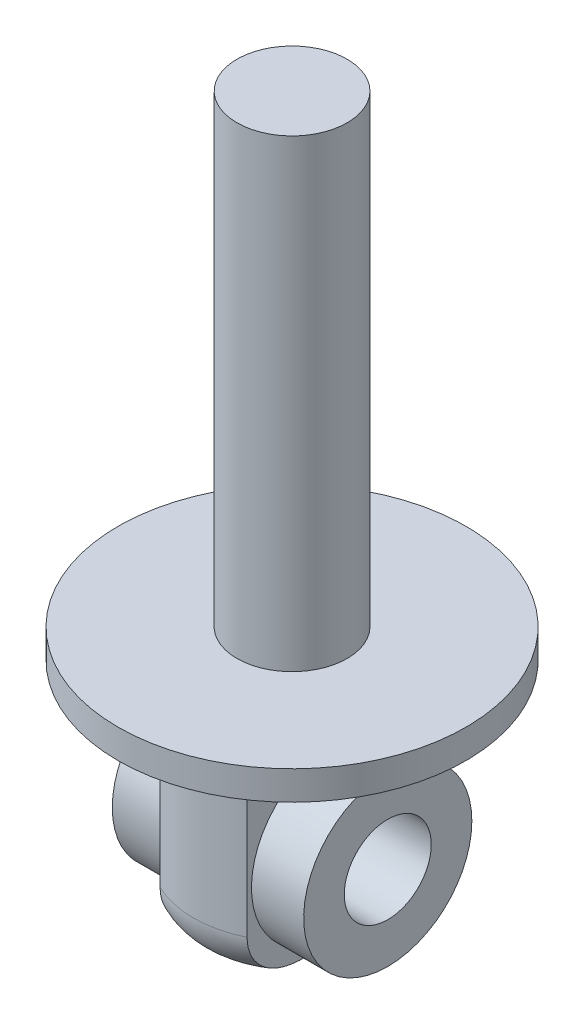
ISO-10303-21;
HEADER;
FILE_DESCRIPTION(('STEP AP214'),'2;1');
FILE_NAME('part.step','',(''),(''),'','','');
FILE_SCHEMA(('AUTOMOTIVE_DESIGN { 1 0 10303 214 1 1 1 1 }'));
ENDSEC;
DATA;
#1=APPLICATION_CONTEXT('core data for automotive mechanical design processes');
#2=APPLICATION_PROTOCOL_DEFINITION('international standard','automotive_design',2000,#1);
#3=PRODUCT_CONTEXT('',#1,'mechanical');
#4=PRODUCT('Part','Part','',(#3));
#5=PRODUCT_RELATED_PRODUCT_CATEGORY('part','',(#4));
#6=PRODUCT_DEFINITION_FORMATION('','',#4);
#7=PRODUCT_DEFINITION_CONTEXT('part definition',#1,'design');
#8=PRODUCT_DEFINITION('design','',#6,#7);
#9=PRODUCT_DEFINITION_SHAPE('','',#8);
#10=(LENGTH_UNIT() NAMED_UNIT(*) SI_UNIT(.MILLI.,.METRE.));
#11=(NAMED_UNIT(*) PLANE_ANGLE_UNIT() SI_UNIT($,.RADIAN.));
#12=(NAMED_UNIT(*) SI_UNIT($,.STERADIAN.) SOLID_ANGLE_UNIT());
#13=UNCERTAINTY_MEASURE_WITH_UNIT(LENGTH_MEASURE(1.E-05),#10,'distance_accuracy_value','');
#14=(GEOMETRIC_REPRESENTATION_CONTEXT(3) GLOBAL_UNCERTAINTY_ASSIGNED_CONTEXT((#13)) GLOBAL_UNIT_ASSIGNED_CONTEXT((#10,
#11,#12)) REPRESENTATION_CONTEXT('',''));
#15=CARTESIAN_POINT('',(0.,0.,0.));
#16=DIRECTION('',(0.,0.,1.));
#17=DIRECTION('',(1.,0.,0.));
#18=AXIS2_PLACEMENT_3D('',#15,#16,#17);
#19=CARTESIAN_POINT('',(7.5,0.,-19.));
#20=DIRECTION('',(-1.,0.,0.));
#21=DIRECTION('',(0.,-1.,0.));
#22=AXIS2_PLACEMENT_3D('',#19,#20,#21);
#23=PLANE('',#22);
#24=DIRECTION('',(0.,0.,1.));
#25=VECTOR('',#24,1.);
#26=CARTESIAN_POINT('',(7.5,-8.,-19.));
#27=LINE('',#26,#25);
#28=CARTESIAN_POINT('',(7.5,-8.,-15.2561463023924));
#29=VERTEX_POINT('',#28);
#30=CARTESIAN_POINT('',(7.5,-8.,15.2561463023924));
#31=VERTEX_POINT('',#30);
#32=EDGE_CURVE('E99',#29,#31,#27,.T.);
#33=ORIENTED_EDGE('',*,*,#32,.T.);
#34=DIRECTION('',(0.,1.,0.));
#35=VECTOR('',#34,1.);
#36=CARTESIAN_POINT('',(7.50000000000001,-38.,15.2561463023924));
#37=LINE('',#36,#35);
#38=CARTESIAN_POINT('',(7.50000000000001,-30.,15.2561463023924));
#39=VERTEX_POINT('',#38);
#40=EDGE_CURVE('E67',#39,#31,#37,.T.);
#41=ORIENTED_EDGE('',*,*,#40,.F.);
#42=CARTESIAN_POINT('',(7.50000000000001,-37.8581168227509,0.));
#43=CARTESIAN_POINT('',(7.50000000000001,-37.8581163914437,-0.158066902513926));
#44=CARTESIAN_POINT('',(7.50000000000001,-37.8590778583365,-0.316133493471296));
#45=CARTESIAN_POINT('',(7.50000000000001,-37.8628433964182,-0.632245132439921));
#46=CARTESIAN_POINT('',(7.50000000000001,-37.8656474766872,-0.790290180341176));
#47=CARTESIAN_POINT('',(7.50000000000001,-37.8765479816375,-1.26438121847554));
#48=CARTESIAN_POINT('',(7.50000000000001,-37.8871326415773,-1.58036865454101));
#49=CARTESIAN_POINT('',(7.50000000000001,-37.9119178014253,-2.21272430533864));
#50=CARTESIAN_POINT('',(7.50000000000001,-37.9261244480962,-2.52909224827329));
#51=CARTESIAN_POINT('',(7.50000000000001,-37.9537767233598,-3.16186118628964));
#52=CARTESIAN_POINT('',(7.50000000000001,-37.967222363136,-3.47826218081714));
#53=CARTESIAN_POINT('',(7.50000000000001,-37.9884767868981,-4.11003426854245));
#54=CARTESIAN_POINT('',(7.50000000000001,-37.9963075572003,-4.42540451161618));
#55=CARTESIAN_POINT('',(7.50000000000001,-38.0016682798353,-5.05630679870717));
#56=CARTESIAN_POINT('',(7.50000000000001,-37.9991974899461,-5.37183885274511));
#57=CARTESIAN_POINT('',(7.50000000000001,-37.9795496351008,-6.00173381322271));
#58=CARTESIAN_POINT('',(7.50000000000001,-37.9624085683985,-6.3160976912921));
#59=CARTESIAN_POINT('',(7.50000000000001,-37.909537804829,-6.94321983277945));
#60=CARTESIAN_POINT('',(7.50000000000001,-37.8738156278536,-7.25597869408596));
#61=CARTESIAN_POINT('',(7.50000000000001,-37.7891160047083,-7.82028509803719));
#62=CARTESIAN_POINT('',(7.50000000000001,-37.743846087472,-8.07238484000144));
#63=CARTESIAN_POINT('',(7.50000000000001,-37.6372210857743,-8.57331616202754));
#64=CARTESIAN_POINT('',(7.50000000000001,-37.5758589453226,-8.82214625805799));
#65=CARTESIAN_POINT('',(7.50000000000001,-37.4357215010974,-9.31525207331062));
#66=CARTESIAN_POINT('',(7.50000000000001,-37.3569228378517,-9.55952120167965));
#67=CARTESIAN_POINT('',(7.50000000000001,-37.1810415461474,-10.0413834579897));
#68=CARTESIAN_POINT('',(7.50000000000001,-37.0839614850497,-10.2789775179708));
#69=CARTESIAN_POINT('',(7.50000000000001,-36.8700449217579,-10.7474912834803));
#70=CARTESIAN_POINT('',(7.50000000000001,-36.7530532122902,-10.9783404393089));
#71=CARTESIAN_POINT('',(7.50000000000001,-36.4996603194695,-11.4291194324461));
#72=CARTESIAN_POINT('',(7.50000000000001,-36.3632621241352,-11.6490509437267));
#73=CARTESIAN_POINT('',(7.50000000000001,-36.0712413914644,-12.0757081290764));
#74=CARTESIAN_POINT('',(7.50000000000001,-35.9156239393498,-12.2824372744898));
#75=CARTESIAN_POINT('',(7.50000000000001,-35.5857083244474,-12.6804248855201));
#76=CARTESIAN_POINT('',(7.50000000000001,-35.4114117257823,-12.8716846441365));
#77=CARTESIAN_POINT('',(7.50000000000001,-35.055125291298,-13.2264751385946));
#78=CARTESIAN_POINT('',(7.50000000000001,-34.8740758365829,-13.3909498884277));
#79=CARTESIAN_POINT('',(7.50000000000001,-34.4973004771136,-13.7021636556086));
#80=CARTESIAN_POINT('',(7.50000000000001,-34.3015746987863,-13.8489028257083));
#81=CARTESIAN_POINT('',(7.50000000000001,-33.896991889927,-14.1228354544413));
#82=CARTESIAN_POINT('',(7.50000000000001,-33.688140069275,-14.2500365997631));
#83=CARTESIAN_POINT('',(7.50000000000001,-33.2589890361795,-14.4833747752035));
#84=CARTESIAN_POINT('',(7.50000000000001,-33.0386912119795,-14.5895143523117));
#85=CARTESIAN_POINT('',(7.50000000000001,-32.6154012691907,-14.7680959371169));
#86=CARTESIAN_POINT('',(7.50000000000001,-32.4134621878923,-14.8430431718907));
#87=CARTESIAN_POINT('',(7.50000000000001,-32.0037459563925,-14.9747800065131));
#88=CARTESIAN_POINT('',(7.50000000000001,-31.7959691779643,-15.0315707598172));
#89=CARTESIAN_POINT('',(7.50000000000001,-31.3762655324674,-15.126387965029));
#90=CARTESIAN_POINT('',(7.50000000000001,-31.1643403824398,-15.1644220165892));
#91=CARTESIAN_POINT('',(7.50000000000001,-30.7379338685723,-15.2213622530823));
#92=CARTESIAN_POINT('',(7.50000000000001,-30.5234525552761,-15.2402688155944));
#93=CARTESIAN_POINT('',(7.50000000000001,-30.104909039521,-15.2582731939286));
#94=CARTESIAN_POINT('',(7.50000000000001,-29.9008885320223,-15.2583552119291));
#95=CARTESIAN_POINT('',(7.50000000000001,-29.4935826126298,-15.2411642704249));
#96=CARTESIAN_POINT('',(7.50000000000001,-29.2902971820622,-15.2238917549458));
#97=CARTESIAN_POINT('',(7.50000000000001,-28.8859327148529,-15.1721560829697));
#98=CARTESIAN_POINT('',(7.50000000000001,-28.6848536314055,-15.1376932918728));
#99=CARTESIAN_POINT('',(7.50000000000001,-28.2863268036977,-15.0519014810784));
#100=CARTESIAN_POINT('',(7.5,-28.0888790891406,-15.0005723234841));
#101=CARTESIAN_POINT('',(7.5,-27.7003301941947,-14.8819350898978));
#102=CARTESIAN_POINT('',(7.5,-27.5091947663743,-14.8147390540692));
#103=CARTESIAN_POINT('',(7.5,-27.1330546774883,-14.6647612069415));
#104=CARTESIAN_POINT('',(7.5,-26.9480525355229,-14.5819730825928));
#105=CARTESIAN_POINT('',(7.5,-26.5854895657449,-14.4015913940951));
#106=CARTESIAN_POINT('',(7.5,-26.4079264801482,-14.3040023642393));
#107=CARTESIAN_POINT('',(7.5,-26.0613052982656,-14.0948845353195));
#108=CARTESIAN_POINT('',(7.5,-25.8922441484138,-13.9833607919423));
#109=CARTESIAN_POINT('',(7.5,-25.5584377126421,-13.7436536710756));
#110=CARTESIAN_POINT('',(7.5,-25.3939843426996,-13.6150638990838));
#111=CARTESIAN_POINT('',(7.5,-25.075897523498,-13.3451470067225));
#112=CARTESIAN_POINT('',(7.5,-24.9222642191878,-13.2038197157751));
#113=CARTESIAN_POINT('',(7.5,-24.6263704901786,-12.9094457279879));
#114=CARTESIAN_POINT('',(7.5,-24.4841217928864,-12.7563872564484));
#115=CARTESIAN_POINT('',(7.5,-24.2116961470686,-12.4398751090542));
#116=CARTESIAN_POINT('',(7.5,-24.0815202699128,-12.2764205127893));
#117=CARTESIAN_POINT('',(7.5,-23.8242557742267,-11.927658185517));
#118=CARTESIAN_POINT('',(7.5,-23.6981410617834,-11.7416321239721));
#119=CARTESIAN_POINT('',(7.5,-23.4605330869615,-11.3604838642093));
#120=CARTESIAN_POINT('',(7.5,-23.3490402625345,-11.1653613937749));
#121=CARTESIAN_POINT('',(7.5,-23.1409195234124,-10.7679474321231));
#122=CARTESIAN_POINT('',(7.5,-23.0442570618084,-10.565673995471));
#123=CARTESIAN_POINT('',(7.5,-22.8652444528667,-10.1548786396514));
#124=CARTESIAN_POINT('',(7.5,-22.7828972028023,-9.94635546558087));
#125=CARTESIAN_POINT('',(7.5,-22.5927296042076,-9.41411195827168));
#126=CARTESIAN_POINT('',(7.5,-22.4940608606604,-9.08709531238531));
#127=CARTESIAN_POINT('',(7.5,-22.32659732624,-8.42548853616651));
#128=CARTESIAN_POINT('',(7.5,-22.257818239245,-8.09089452161139));
#129=CARTESIAN_POINT('',(7.5,-22.1464857809049,-7.41530630650783));
#130=CARTESIAN_POINT('',(7.5,-22.1040983491176,-7.07428522894102));
#131=CARTESIAN_POINT('',(7.5,-22.0574807189511,-6.56138099468495));
#132=CARTESIAN_POINT('',(7.5,-22.0447690523196,-6.39019594435743));
#133=CARTESIAN_POINT('',(7.5,-22.0243697616363,-6.04753662803091));
#134=CARTESIAN_POINT('',(7.5,-22.0166817407884,-5.8760623859468));
#135=CARTESIAN_POINT('',(7.5,-21.9979753272499,-5.29205860548671));
#136=CARTESIAN_POINT('',(7.5,-21.9974436399753,-4.87920290681012));
#137=CARTESIAN_POINT('',(7.5,-22.0117245200398,-4.05370276472098));
#138=CARTESIAN_POINT('',(7.5,-22.0265456750039,-3.64105856884922));
#139=CARTESIAN_POINT('',(7.5,-22.0522144294526,-3.02219354910122));
#140=CARTESIAN_POINT('',(7.5,-22.0613451269114,-2.81589150327047));
#141=CARTESIAN_POINT('',(7.5,-22.0794518484651,-2.40328065372291));
#142=CARTESIAN_POINT('',(7.5,-22.0884278736782,-2.1969718500658));
#143=CARTESIAN_POINT('',(7.5,-22.105037858016,-1.78438003000401));
#144=CARTESIAN_POINT('',(7.5,-22.1126723476544,-1.5780970357879));
#145=CARTESIAN_POINT('',(7.5,-22.1256299930241,-1.16545733411358));
#146=CARTESIAN_POINT('',(7.5,-22.1309531723266,-0.959100627428577));
#147=CARTESIAN_POINT('',(7.5,-22.1386171932296,-0.546272159073854));
#148=CARTESIAN_POINT('',(7.5,-22.1409572065908,-0.339800381367087));
#149=CARTESIAN_POINT('',(7.5,-22.1423569705871,0.0731546236815097));
#150=CARTESIAN_POINT('',(7.5,-22.1414167235139,0.279637851015239));
#151=CARTESIAN_POINT('',(7.5,-22.1363739646546,0.692613501258891));
#152=CARTESIAN_POINT('',(7.5,-22.1322706958282,0.89910591453483));
#153=CARTESIAN_POINT('',(7.5,-22.1214190692184,1.31201951360881));
#154=CARTESIAN_POINT('',(7.5,-22.1146706926462,1.51844069889048));
#155=CARTESIAN_POINT('',(7.5,-22.0993813551277,1.93131002620987));
#156=CARTESIAN_POINT('',(7.5,-22.0908395659989,2.13775813650925));
#157=CARTESIAN_POINT('',(7.5,-22.0730737601536,2.55062536753738));
#158=CARTESIAN_POINT('',(7.5,-22.063849730293,2.7570444876308));
#159=CARTESIAN_POINT('',(7.5,-22.0370473168871,3.37628283251669));
#160=CARTESIAN_POINT('',(7.5,-22.0203351372988,3.7891540541983));
#161=CARTESIAN_POINT('',(7.5,-22.0023742578304,4.51802156646452));
#162=CARTESIAN_POINT('',(7.5,-21.9984109397109,4.83393614152462));
#163=CARTESIAN_POINT('',(7.5,-22.0027852054218,5.46564319354551));
#164=CARTESIAN_POINT('',(7.5,-22.0111191117594,5.78143567877123));
#165=CARTESIAN_POINT('',(7.5,-22.0443026614422,6.41163878081927));
#166=CARTESIAN_POINT('',(7.5,-22.0691217998812,6.72605087228873));
#167=CARTESIAN_POINT('',(7.5,-22.1389757261729,7.35273604101087));
#168=CARTESIAN_POINT('',(7.5,-22.1840129020606,7.66500886116068));
#169=CARTESIAN_POINT('',(7.5,-22.298410699586,8.29058648729538));
#170=CARTESIAN_POINT('',(7.5,-22.36816779516,8.60382026590342));
#171=CARTESIAN_POINT('',(7.5,-22.5344840752214,9.2231933025351));
#172=CARTESIAN_POINT('',(7.5,-22.6310441579557,9.52933232241988));
#173=CARTESIAN_POINT('',(7.5,-22.8529286369855,10.1313823568173));
#174=CARTESIAN_POINT('',(7.5,-22.9782778944808,10.4272842753627));
#175=CARTESIAN_POINT('',(7.5,-23.258722740325,11.0046349389401));
#176=CARTESIAN_POINT('',(7.5,-23.4138063099641,11.2860894655827));
#177=CARTESIAN_POINT('',(7.5,-23.704316085326,11.7511273199415));
#178=CARTESIAN_POINT('',(7.5,-23.8323388586496,11.9393656314455));
#179=CARTESIAN_POINT('',(7.5,-24.1031260705068,12.3049026815023));
#180=CARTESIAN_POINT('',(7.5,-24.2458871809597,12.4822038753951));
#181=CARTESIAN_POINT('',(7.5,-24.5455306876249,12.8241371944489));
#182=CARTESIAN_POINT('',(7.5,-24.7023985023718,12.9887820825511));
#183=CARTESIAN_POINT('',(7.5,-25.0296640810817,13.3040640113117));
#184=CARTESIAN_POINT('',(7.5,-25.2000624132405,13.4547004631273));
#185=CARTESIAN_POINT('',(7.5,-25.5542199788329,13.741109358514));
#186=CARTESIAN_POINT('',(7.5,-25.7380361846556,13.8768114535095));
#187=CARTESIAN_POINT('',(7.5,-26.1171370407505,14.1311465244135));
#188=CARTESIAN_POINT('',(7.5,-26.3124217976797,14.2497793415428));
#189=CARTESIAN_POINT('',(7.5,-26.713065658512,14.4687058766614));
#190=CARTESIAN_POINT('',(7.5,-26.9184264380326,14.568996531195));
#191=CARTESIAN_POINT('',(7.5,-27.3375663300785,14.7500879542287));
#192=CARTESIAN_POINT('',(7.5,-27.5513448407918,14.8308901130943));
#193=CARTESIAN_POINT('',(7.5,-27.969161258456,14.9667621603902));
#194=CARTESIAN_POINT('',(7.50000000000001,-28.1727189629669,15.0233124543797));
#195=CARTESIAN_POINT('',(7.50000000000001,-28.58399808603,15.1184069236228));
#196=CARTESIAN_POINT('',(7.50000000000001,-28.7917193462908,15.1569517820642));
#197=CARTESIAN_POINT('',(7.50000000000001,-29.2096717953461,15.2156370657254));
#198=CARTESIAN_POINT('',(7.50000000000001,-29.4199020831965,15.235783907172));
#199=CARTESIAN_POINT('',(7.50000000000001,-29.8413202041609,15.2574917991121));
#200=CARTESIAN_POINT('',(7.50000000000001,-30.0525080218126,15.2590531486667));
#201=CARTESIAN_POINT('',(7.50000000000001,-30.4659759107449,15.2438780065002));
#202=CARTESIAN_POINT('',(7.50000000000001,-30.6682824389378,15.2278521028527));
#203=CARTESIAN_POINT('',(7.50000000000001,-31.0708880316323,15.1787651345065));
#204=CARTESIAN_POINT('',(7.50000000000001,-31.2711863982316,15.1456983433954));
#205=CARTESIAN_POINT('',(7.50000000000001,-31.6682022617911,15.0628527892862));
#206=CARTESIAN_POINT('',(7.50000000000001,-31.8649212794318,15.0130813066933));
#207=CARTESIAN_POINT('',(7.50000000000001,-32.2535977605036,14.8972564663364));
#208=CARTESIAN_POINT('',(7.50000000000001,-32.4455530675325,14.8311958777462));
#209=CARTESIAN_POINT('',(7.50000000000001,-32.8237202019985,14.68325174523));
#210=CARTESIAN_POINT('',(7.50000000000001,-33.0099193039063,14.601335697515));
#211=CARTESIAN_POINT('',(7.50000000000001,-33.3748876530672,14.4225394985237));
#212=CARTESIAN_POINT('',(7.50000000000001,-33.5536598976617,14.325665459951));
#213=CARTESIAN_POINT('',(7.50000000000001,-33.9028288439669,14.1177433899504));
#214=CARTESIAN_POINT('',(7.50000000000001,-34.0732229826964,14.0066910580907));
#215=CARTESIAN_POINT('',(7.50000000000001,-34.4045768150321,13.7714126903758));
#216=CARTESIAN_POINT('',(7.50000000000001,-34.5655390953551,13.6471902929567));
#217=CARTESIAN_POINT('',(7.50000000000001,-34.8835021588696,13.3813505085012));
#218=CARTESIAN_POINT('',(7.50000000000001,-35.0400874899574,13.2392363203611));
#219=CARTESIAN_POINT('',(7.50000000000001,-35.3414844667383,12.9430408305315));
#220=CARTESIAN_POINT('',(7.50000000000001,-35.486295881384,12.7889592941145));
#221=CARTESIAN_POINT('',(7.50000000000001,-35.7636315123475,12.4700170802715));
#222=CARTESIAN_POINT('',(7.50000000000001,-35.8961509332565,12.305152238426));
#223=CARTESIAN_POINT('',(7.50000000000001,-36.1484627585452,11.9659531446674));
#224=CARTESIAN_POINT('',(7.50000000000001,-36.2682540455747,11.7916180634279));
#225=CARTESIAN_POINT('',(7.50000000000001,-36.5048350691442,11.4190908039592));
#226=CARTESIAN_POINT('',(7.50000000000001,-36.6204410947904,11.2201469753721));
#227=CARTESIAN_POINT('',(7.50000000000001,-36.8363203600944,10.8141259879307));
#228=CARTESIAN_POINT('',(7.50000000000001,-36.9365929673382,10.6070484940527));
#229=CARTESIAN_POINT('',(7.50000000000001,-37.1219553636071,10.1864131496894));
#230=CARTESIAN_POINT('',(7.50000000000001,-37.2070567475996,9.97286039541023));
#231=CARTESIAN_POINT('',(7.50000000000001,-37.3626304420474,9.54051075214828));
#232=CARTESIAN_POINT('',(7.50000000000001,-37.4331014843788,9.32171341040875));
#233=CARTESIAN_POINT('',(7.50000000000001,-37.6018626360258,8.73471591511386));
#234=CARTESIAN_POINT('',(7.50000000000001,-37.6879337807964,8.36296673057776));
#235=CARTESIAN_POINT('',(7.50000000000001,-37.8258699247813,7.61318379631765));
#236=CARTESIAN_POINT('',(7.50000000000001,-37.8777135385324,7.23514626853446));
#237=CARTESIAN_POINT('',(7.50000000000001,-37.9529687445834,6.47487065067854));
#238=CARTESIAN_POINT('',(7.50000000000001,-37.9762658467518,6.09262180970962));
#239=CARTESIAN_POINT('',(7.50000000000001,-38.0009998809241,5.32761027538954));
#240=CARTESIAN_POINT('',(7.50000000000001,-38.0024392888314,4.94484764514949));
#241=CARTESIAN_POINT('',(7.50000000000001,-37.9914600885569,4.18151755294443));
#242=CARTESIAN_POINT('',(7.50000000000001,-37.979110068776,3.80094860658969));
#243=CARTESIAN_POINT('',(7.50000000000001,-37.9491271153583,3.0399859985068));
#244=CARTESIAN_POINT('',(7.50000000000001,-37.9314932216101,2.65959238122878));
#245=CARTESIAN_POINT('',(7.50000000000001,-37.9071510098742,2.0892432771357));
#246=CARTESIAN_POINT('',(7.50000000000001,-37.8993943367976,1.89933578350766));
#247=CARTESIAN_POINT('',(7.50000000000001,-37.885410639827,1.5194627936075));
#248=CARTESIAN_POINT('',(7.50000000000001,-37.8791836149317,1.32949729737344));
#249=CARTESIAN_POINT('',(7.50000000000001,-37.868937407115,0.949627781596153));
#250=CARTESIAN_POINT('',(7.50000000000001,-37.8649167958499,0.759723802006555));
#251=CARTESIAN_POINT('',(7.50000000000001,-37.8595067832012,0.379879731251264));
#252=CARTESIAN_POINT('',(7.50000000000001,-37.8581173410272,0.189939640691047));
#253=CARTESIAN_POINT('',(7.50000000000001,-37.8581168227509,0.));
#254=B_SPLINE_CURVE_WITH_KNOTS('',3,(#42,#43,#44,#45,#46,#47,#48,#49,#50,#51,#52,#53,#54,#55,
#56,#57,#58,#59,#60,#61,#62,#63,#64,#65,#66,#67,#68,#69,#70,#71,#72,#73,#74,#75,#76,#77,#78,#79,
#80,#81,#82,#83,#84,#85,#86,#87,#88,#89,#90,#91,#92,#93,#94,#95,#96,#97,#98,#99,#100,#101,#102,
#103,#104,#105,#106,#107,#108,#109,#110,#111,#112,#113,#114,#115,#116,#117,#118,#119,#120,#121,
#122,#123,#124,#125,#126,#127,#128,#129,#130,#131,#132,#133,#134,#135,#136,#137,#138,#139,#140,
#141,#142,#143,#144,#145,#146,#147,#148,#149,#150,#151,#152,#153,#154,#155,#156,#157,#158,#159,
#160,#161,#162,#163,#164,#165,#166,#167,#168,#169,#170,#171,#172,#173,#174,#175,#176,#177,#178,
#179,#180,#181,#182,#183,#184,#185,#186,#187,#188,#189,#190,#191,#192,#193,#194,#195,#196,#197,
#198,#199,#200,#201,#202,#203,#204,#205,#206,#207,#208,#209,#210,#211,#212,#213,#214,#215,#216,
#217,#218,#219,#220,#221,#222,#223,#224,#225,#226,#227,#228,#229,#230,#231,#232,#233,#234,#235,
#236,#237,#238,#239,#240,#241,#242,#243,#244,#245,#246,#247,#248,#249,#250,#251,#252,#253),
.UNSPECIFIED.,.T.,.F.,(4,2,2,2,2,2,2,2,2,2,2,2,2,2,2,2,2,2,2,2,2,2,2,2,2,2,2,2,2,2,2,2,2,2,2,2,
2,2,2,2,2,2,2,2,2,2,2,2,2,2,2,2,2,2,2,2,2,2,2,2,2,2,2,2,2,2,2,2,2,2,2,2,2,2,2,2,2,2,2,2,2,2,2,2,
2,2,2,2,2,2,2,2,2,2,2,2,2,2,2,2,2,2,2,2,2,4),(0.,0.474197450846028,0.948397238450114,
1.89684014930883,2.84690347393168,3.7969528333212,4.74326143236818,5.6896382136262,
6.63369939067316,7.57737879716424,8.34531332587414,9.11358513704412,9.88289249084583,
10.6520918868923,11.4275873750403,12.2029635890231,12.9781350840353,13.7532417196969,
14.486006530758,15.2187650302545,15.9512345039485,16.6836153455654,17.3289936286194,
17.9743309035522,18.6194064919276,19.2644693461753,19.8757983196052,20.4871116522348,
21.0984119912205,21.7097173282329,22.3168287715689,22.924186557563,23.5313586524722,
24.1383110940113,24.7639003004272,25.3894978858352,26.0157318264194,26.6420212873707,
27.3155620806634,27.9891230430995,28.6610903290857,29.3331934574147,30.356248313729,
31.3798400300877,32.4098043322769,32.9247158001471,33.4395865924651,34.6775558379316,
35.9162179166231,36.5357327183807,37.1552430387062,37.7745078179381,38.3937662816073,
39.0131966373501,39.6326265603412,40.2522047842775,40.8717874092979,41.4916567840967,
42.1115381045401,43.3510874401717,44.2987505921578,45.2461304023068,46.1917620102747,
47.1375053400549,48.0991600182179,49.0608469281501,50.0233674566333,50.9854997481387,
51.6677729509695,52.3498924245019,53.0313147530206,53.7127657121018,54.3973004283824,
55.0818415118222,55.7664968211584,56.4511032707486,57.0841123435562,57.7170973958839,
58.3498616130863,58.9826156484033,59.5907150061715,60.199018842758,60.807057905829,
61.4153673683328,62.0249373355084,62.6342588530848,63.2437656255857,63.8531044489578,
64.4867970090982,65.1205020016142,65.7544531872739,66.3884599789895,67.0780460700122,
67.7676605947718,68.4567457843789,69.1458906773754,70.2886254258239,71.4320734843434,
72.5800926613664,73.7279817969636,74.870186684837,76.0125992441739,76.5827930171269,
77.1529864168401,77.7228102594496,78.2926252681442),.UNSPECIFIED.);
#255=CARTESIAN_POINT('',(7.5,-38.,4.97493718553306));
#256=VERTEX_POINT('',#255);
#257=EDGE_CURVE('E126',#39,#256,#254,.T.);
#258=ORIENTED_EDGE('',*,*,#257,.T.);
#259=DIRECTION('',(0.,0.,1.));
#260=VECTOR('',#259,1.);
#261=CARTESIAN_POINT('',(7.5,-38.,-19.));
#262=LINE('',#261,#260);
#263=CARTESIAN_POINT('',(7.5,-38.,-4.97493718553309));
#264=VERTEX_POINT('',#263);
#265=EDGE_CURVE('E111',#264,#256,#262,.T.);
#266=ORIENTED_EDGE('',*,*,#265,.F.);
#267=CARTESIAN_POINT('',(7.50000000000001,-30.,-15.2561463023924));
#268=VERTEX_POINT('',#267);
#269=EDGE_CURVE('E101',#264,#268,#254,.T.);
#270=ORIENTED_EDGE('',*,*,#269,.T.);
#271=DIRECTION('',(0.,1.,0.));
#272=VECTOR('',#271,1.);
#273=CARTESIAN_POINT('',(7.50000000000001,-38.,-15.2561463023924));
#274=LINE('',#273,#272);
#275=EDGE_CURVE('E96',#29,#268,#274,.F.);
#276=ORIENTED_EDGE('',*,*,#275,.F.);
#277=EDGE_LOOP('',(#33,#41,#258,#266,#270,#276));
#278=FACE_BOUND('',#277,.T.);
#279=CARTESIAN_POINT('',(7.5,-23.,0.));
#280=DIRECTION('',(-1.,0.,0.));
#281=DIRECTION('',(0.,-1.,0.));
#282=AXIS2_PLACEMENT_3D('',#279,#280,#281);
#283=CIRCLE('',#282,14.5);
#284=CARTESIAN_POINT('',(7.50000000000001,-37.5,0.));
#285=VERTEX_POINT('',#284);
#286=EDGE_CURVE('E12',#285,#285,#283,.F.);
#287=ORIENTED_EDGE('',*,*,#286,.F.);
#288=EDGE_LOOP('',(#287));
#289=FACE_BOUND('',#288,.T.);
#290=ADVANCED_FACE('F41',(#278,#289),#23,.F.);
#291=CARTESIAN_POINT('',(-7.5,0.,-19.));
#292=DIRECTION('',(-1.,0.,0.));
#293=DIRECTION('',(0.,0.,1.));
#294=AXIS2_PLACEMENT_3D('',#291,#292,#293);
#295=PLANE('',#294);
#296=DIRECTION('',(0.,1.,0.));
#297=VECTOR('',#296,1.);
#298=CARTESIAN_POINT('',(-7.5,-38.,-15.2561463023924));
#299=LINE('',#298,#297);
#300=CARTESIAN_POINT('',(-7.5,-8.,-15.2561463023924));
#301=VERTEX_POINT('',#300);
#302=CARTESIAN_POINT('',(-7.5,-30.,-15.2561463023924));
#303=VERTEX_POINT('',#302);
#304=EDGE_CURVE('E186',#301,#303,#299,.F.);
#305=ORIENTED_EDGE('',*,*,#304,.T.);
#306=CARTESIAN_POINT('',(-7.5,-37.8581168227509,0.));
#307=CARTESIAN_POINT('',(-7.5,-37.8581163914437,-0.158066902513925));
#308=CARTESIAN_POINT('',(-7.5,-37.8590778583365,-0.316133493471296));
#309=CARTESIAN_POINT('',(-7.5,-37.8628433964182,-0.63224513243992));
#310=CARTESIAN_POINT('',(-7.5,-37.8656474766872,-0.790290180341175));
#311=CARTESIAN_POINT('',(-7.5,-37.8765479816375,-1.26438121847554));
#312=CARTESIAN_POINT('',(-7.5,-37.8871326415773,-1.58036865454101));
#313=CARTESIAN_POINT('',(-7.5,-37.9119178014253,-2.21272430533864));
#314=CARTESIAN_POINT('',(-7.5,-37.9261244480962,-2.52909224827329));
#315=CARTESIAN_POINT('',(-7.5,-37.9537767233598,-3.16186118628964));
#316=CARTESIAN_POINT('',(-7.5,-37.967222363136,-3.47826218081714));
#317=CARTESIAN_POINT('',(-7.5,-37.9884767868981,-4.11003426854245));
#318=CARTESIAN_POINT('',(-7.5,-37.9963075572003,-4.42540451161618));
#319=CARTESIAN_POINT('',(-7.5,-38.0016682798353,-5.05630679870716));
#320=CARTESIAN_POINT('',(-7.5,-37.9991974899461,-5.37183885274511));
#321=CARTESIAN_POINT('',(-7.5,-37.9795496351008,-6.00173381322271));
#322=CARTESIAN_POINT('',(-7.5,-37.9624085683985,-6.3160976912921));
#323=CARTESIAN_POINT('',(-7.5,-37.909537804829,-6.94321983277944));
#324=CARTESIAN_POINT('',(-7.5,-37.8738156278536,-7.25597869408596));
#325=CARTESIAN_POINT('',(-7.5,-37.7891160047083,-7.82028509803718));
#326=CARTESIAN_POINT('',(-7.5,-37.743846087472,-8.07238484000143));
#327=CARTESIAN_POINT('',(-7.5,-37.6372210857743,-8.57331616202754));
#328=CARTESIAN_POINT('',(-7.5,-37.5758589453226,-8.82214625805798));
#329=CARTESIAN_POINT('',(-7.5,-37.4357215010974,-9.31525207331062));
#330=CARTESIAN_POINT('',(-7.5,-37.3569228378517,-9.55952120167965));
#331=CARTESIAN_POINT('',(-7.5,-37.1810415461474,-10.0413834579896));
#332=CARTESIAN_POINT('',(-7.5,-37.0839614850497,-10.2789775179708));
#333=CARTESIAN_POINT('',(-7.5,-36.8700449217579,-10.7474912834803));
#334=CARTESIAN_POINT('',(-7.5,-36.7530532122902,-10.9783404393089));
#335=CARTESIAN_POINT('',(-7.5,-36.4996603194695,-11.4291194324461));
#336=CARTESIAN_POINT('',(-7.5,-36.3632621241352,-11.6490509437267));
#337=CARTESIAN_POINT('',(-7.5,-36.0712413914644,-12.0757081290764));
#338=CARTESIAN_POINT('',(-7.5,-35.9156239393498,-12.2824372744898));
#339=CARTESIAN_POINT('',(-7.5,-35.5857083244474,-12.6804248855201));
#340=CARTESIAN_POINT('',(-7.5,-35.4114117257823,-12.8716846441365));
#341=CARTESIAN_POINT('',(-7.5,-35.055125291298,-13.2264751385946));
#342=CARTESIAN_POINT('',(-7.5,-34.8740758365829,-13.3909498884277));
#343=CARTESIAN_POINT('',(-7.5,-34.4973004771136,-13.7021636556086));
#344=CARTESIAN_POINT('',(-7.5,-34.3015746987863,-13.8489028257083));
#345=CARTESIAN_POINT('',(-7.5,-33.896991889927,-14.1228354544413));
#346=CARTESIAN_POINT('',(-7.5,-33.688140069275,-14.2500365997631));
#347=CARTESIAN_POINT('',(-7.5,-33.2589890361795,-14.4833747752035));
#348=CARTESIAN_POINT('',(-7.5,-33.0386912119795,-14.5895143523117));
#349=CARTESIAN_POINT('',(-7.5,-32.6154012691907,-14.7680959371169));
#350=CARTESIAN_POINT('',(-7.5,-32.4134621878923,-14.8430431718907));
#351=CARTESIAN_POINT('',(-7.5,-32.0037459563925,-14.9747800065131));
#352=CARTESIAN_POINT('',(-7.5,-31.7959691779643,-15.0315707598173));
#353=CARTESIAN_POINT('',(-7.5,-31.3762655324674,-15.126387965029));
#354=CARTESIAN_POINT('',(-7.5,-31.1643403824398,-15.1644220165892));
#355=CARTESIAN_POINT('',(-7.5,-30.7379338685723,-15.2213622530823));
#356=CARTESIAN_POINT('',(-7.5,-30.5234525552761,-15.2402688155944));
#357=CARTESIAN_POINT('',(-7.5,-30.104909039521,-15.2582731939286));
#358=CARTESIAN_POINT('',(-7.5,-29.9008885320223,-15.2583552119291));
#359=CARTESIAN_POINT('',(-7.5,-29.4935826126298,-15.2411642704249));
#360=CARTESIAN_POINT('',(-7.5,-29.2902971820622,-15.2238917549458));
#361=CARTESIAN_POINT('',(-7.5,-28.8859327148529,-15.1721560829698));
#362=CARTESIAN_POINT('',(-7.5,-28.6848536314055,-15.1376932918728));
#363=CARTESIAN_POINT('',(-7.5,-28.2863268036977,-15.0519014810784));
#364=CARTESIAN_POINT('',(-7.5,-28.0888790891406,-15.0005723234841));
#365=CARTESIAN_POINT('',(-7.5,-27.7003301941947,-14.8819350898978));
#366=CARTESIAN_POINT('',(-7.5,-27.5091947663743,-14.8147390540692));
#367=CARTESIAN_POINT('',(-7.5,-27.1330546774883,-14.6647612069415));
#368=CARTESIAN_POINT('',(-7.5,-26.9480525355229,-14.5819730825928));
#369=CARTESIAN_POINT('',(-7.5,-26.5854895657449,-14.4015913940951));
#370=CARTESIAN_POINT('',(-7.5,-26.4079264801482,-14.3040023642393));
#371=CARTESIAN_POINT('',(-7.5,-26.0613052982656,-14.0948845353195));
#372=CARTESIAN_POINT('',(-7.5,-25.8922441484138,-13.9833607919423));
#373=CARTESIAN_POINT('',(-7.5,-25.5584377126421,-13.7436536710756));
#374=CARTESIAN_POINT('',(-7.5,-25.3939843426996,-13.6150638990838));
#375=CARTESIAN_POINT('',(-7.5,-25.075897523498,-13.3451470067225));
#376=CARTESIAN_POINT('',(-7.5,-24.9222642191878,-13.2038197157751));
#377=CARTESIAN_POINT('',(-7.5,-24.6263704901786,-12.9094457279879));
#378=CARTESIAN_POINT('',(-7.5,-24.4841217928864,-12.7563872564484));
#379=CARTESIAN_POINT('',(-7.5,-24.2116961470686,-12.4398751090542));
#380=CARTESIAN_POINT('',(-7.5,-24.0815202699128,-12.2764205127893));
#381=CARTESIAN_POINT('',(-7.5,-23.8242557742267,-11.927658185517));
#382=CARTESIAN_POINT('',(-7.5,-23.6981410617834,-11.7416321239721));
#383=CARTESIAN_POINT('',(-7.5,-23.4605330869615,-11.3604838642093));
#384=CARTESIAN_POINT('',(-7.5,-23.3490402625345,-11.1653613937749));
#385=CARTESIAN_POINT('',(-7.5,-23.1409195234124,-10.7679474321231));
#386=CARTESIAN_POINT('',(-7.5,-23.0442570618084,-10.565673995471));
#387=CARTESIAN_POINT('',(-7.5,-22.8652444528667,-10.1548786396514));
#388=CARTESIAN_POINT('',(-7.5,-22.7828972028023,-9.94635546558087));
#389=CARTESIAN_POINT('',(-7.5,-22.5927296042076,-9.41411195827168));
#390=CARTESIAN_POINT('',(-7.5,-22.4940608606604,-9.08709531238531));
#391=CARTESIAN_POINT('',(-7.5,-22.32659732624,-8.4254885361665));
#392=CARTESIAN_POINT('',(-7.5,-22.257818239245,-8.09089452161139));
#393=CARTESIAN_POINT('',(-7.5,-22.1464857809049,-7.41530630650783));
#394=CARTESIAN_POINT('',(-7.5,-22.1040983491176,-7.07428522894103));
#395=CARTESIAN_POINT('',(-7.5,-22.0574807189511,-6.56138099468496));
#396=CARTESIAN_POINT('',(-7.5,-22.0447690523196,-6.39019594435744));
#397=CARTESIAN_POINT('',(-7.5,-22.0243697616363,-6.04753662803091));
#398=CARTESIAN_POINT('',(-7.5,-22.0166817407884,-5.8760623859468));
#399=CARTESIAN_POINT('',(-7.5,-21.9979753272499,-5.29205860548671));
#400=CARTESIAN_POINT('',(-7.5,-21.9974436399753,-4.87920290681013));
#401=CARTESIAN_POINT('',(-7.5,-22.0117245200398,-4.05370276472098));
#402=CARTESIAN_POINT('',(-7.5,-22.0265456750039,-3.64105856884923));
#403=CARTESIAN_POINT('',(-7.5,-22.0522144294526,-3.02219354910122));
#404=CARTESIAN_POINT('',(-7.5,-22.0613451269114,-2.81589150327047));
#405=CARTESIAN_POINT('',(-7.5,-22.0794518484651,-2.40328065372292));
#406=CARTESIAN_POINT('',(-7.5,-22.0884278736782,-2.1969718500658));
#407=CARTESIAN_POINT('',(-7.5,-22.105037858016,-1.78438003000402));
#408=CARTESIAN_POINT('',(-7.5,-22.1126723476544,-1.5780970357879));
#409=CARTESIAN_POINT('',(-7.5,-22.1256299930241,-1.16545733411358));
#410=CARTESIAN_POINT('',(-7.5,-22.1309531723266,-0.959100627428575));
#411=CARTESIAN_POINT('',(-7.5,-22.1386171932296,-0.546272159073849));
#412=CARTESIAN_POINT('',(-7.5,-22.1409572065908,-0.339800381367082));
#413=CARTESIAN_POINT('',(-7.5,-22.1423569705871,0.0731546236815147));
#414=CARTESIAN_POINT('',(-7.5,-22.1414167235139,0.279637851015244));
#415=CARTESIAN_POINT('',(-7.5,-22.1363739646546,0.692613501258896));
#416=CARTESIAN_POINT('',(-7.5,-22.1322706958282,0.899105914534834));
#417=CARTESIAN_POINT('',(-7.5,-22.1214190692184,1.31201951360882));
#418=CARTESIAN_POINT('',(-7.5,-22.1146706926462,1.51844069889049));
#419=CARTESIAN_POINT('',(-7.5,-22.0993813551277,1.93131002620988));
#420=CARTESIAN_POINT('',(-7.5,-22.0908395659989,2.13775813650926));
#421=CARTESIAN_POINT('',(-7.5,-22.0730737601536,2.55062536753739));
#422=CARTESIAN_POINT('',(-7.5,-22.063849730293,2.75704448763081));
#423=CARTESIAN_POINT('',(-7.5,-22.0370473168871,3.37628283251671));
#424=CARTESIAN_POINT('',(-7.5,-22.0203351372988,3.78915405419832));
#425=CARTESIAN_POINT('',(-7.5,-22.0023742578304,4.51802156646454));
#426=CARTESIAN_POINT('',(-7.5,-21.9984109397109,4.83393614152464));
#427=CARTESIAN_POINT('',(-7.5,-22.0027852054218,5.46564319354553));
#428=CARTESIAN_POINT('',(-7.5,-22.0111191117594,5.78143567877124));
#429=CARTESIAN_POINT('',(-7.5,-22.0443026614422,6.41163878081928));
#430=CARTESIAN_POINT('',(-7.5,-22.0691217998812,6.72605087228874));
#431=CARTESIAN_POINT('',(-7.5,-22.1389757261729,7.35273604101088));
#432=CARTESIAN_POINT('',(-7.5,-22.1840129020606,7.66500886116069));
#433=CARTESIAN_POINT('',(-7.5,-22.298410699586,8.29058648729539));
#434=CARTESIAN_POINT('',(-7.5,-22.36816779516,8.60382026590343));
#435=CARTESIAN_POINT('',(-7.5,-22.5344840752214,9.2231933025351));
#436=CARTESIAN_POINT('',(-7.5,-22.6310441579557,9.52933232241989));
#437=CARTESIAN_POINT('',(-7.5,-22.8529286369855,10.1313823568173));
#438=CARTESIAN_POINT('',(-7.5,-22.9782778944808,10.4272842753627));
#439=CARTESIAN_POINT('',(-7.5,-23.258722740325,11.0046349389401));
#440=CARTESIAN_POINT('',(-7.5,-23.4138063099641,11.2860894655827));
#441=CARTESIAN_POINT('',(-7.5,-23.704316085326,11.7511273199415));
#442=CARTESIAN_POINT('',(-7.5,-23.8323388586496,11.9393656314455));
#443=CARTESIAN_POINT('',(-7.5,-24.1031260705068,12.3049026815023));
#444=CARTESIAN_POINT('',(-7.5,-24.2458871809597,12.4822038753951));
#445=CARTESIAN_POINT('',(-7.5,-24.5455306876248,12.8241371944489));
#446=CARTESIAN_POINT('',(-7.5,-24.7023985023718,12.9887820825511));
#447=CARTESIAN_POINT('',(-7.5,-25.0296640810817,13.3040640113117));
#448=CARTESIAN_POINT('',(-7.5,-25.2000624132405,13.4547004631273));
#449=CARTESIAN_POINT('',(-7.5,-25.5542199788329,13.741109358514));
#450=CARTESIAN_POINT('',(-7.5,-25.7380361846556,13.8768114535095));
#451=CARTESIAN_POINT('',(-7.5,-26.1171370407505,14.1311465244135));
#452=CARTESIAN_POINT('',(-7.5,-26.3124217976797,14.2497793415428));
#453=CARTESIAN_POINT('',(-7.5,-26.713065658512,14.4687058766614));
#454=CARTESIAN_POINT('',(-7.5,-26.9184264380326,14.568996531195));
#455=CARTESIAN_POINT('',(-7.5,-27.3375663300785,14.7500879542287));
#456=CARTESIAN_POINT('',(-7.5,-27.5513448407918,14.8308901130943));
#457=CARTESIAN_POINT('',(-7.5,-27.969161258456,14.9667621603902));
#458=CARTESIAN_POINT('',(-7.5,-28.1727189629669,15.0233124543797));
#459=CARTESIAN_POINT('',(-7.5,-28.58399808603,15.1184069236228));
#460=CARTESIAN_POINT('',(-7.5,-28.7917193462908,15.1569517820642));
#461=CARTESIAN_POINT('',(-7.5,-29.2096717953462,15.2156370657254));
#462=CARTESIAN_POINT('',(-7.5,-29.4199020831965,15.235783907172));
#463=CARTESIAN_POINT('',(-7.5,-29.8413202041609,15.2574917991121));
#464=CARTESIAN_POINT('',(-7.5,-30.0525080218126,15.2590531486667));
#465=CARTESIAN_POINT('',(-7.5,-30.4659759107449,15.2438780065002));
#466=CARTESIAN_POINT('',(-7.5,-30.6682824389378,15.2278521028527));
#467=CARTESIAN_POINT('',(-7.5,-31.0708880316323,15.1787651345065));
#468=CARTESIAN_POINT('',(-7.5,-31.2711863982316,15.1456983433954));
#469=CARTESIAN_POINT('',(-7.5,-31.6682022617911,15.0628527892862));
#470=CARTESIAN_POINT('',(-7.5,-31.8649212794318,15.0130813066933));
#471=CARTESIAN_POINT('',(-7.5,-32.2535977605036,14.8972564663364));
#472=CARTESIAN_POINT('',(-7.5,-32.4455530675325,14.8311958777462));
#473=CARTESIAN_POINT('',(-7.5,-32.8237202019985,14.68325174523));
#474=CARTESIAN_POINT('',(-7.5,-33.0099193039063,14.601335697515));
#475=CARTESIAN_POINT('',(-7.5,-33.3748876530672,14.4225394985237));
#476=CARTESIAN_POINT('',(-7.5,-33.5536598976617,14.325665459951));
#477=CARTESIAN_POINT('',(-7.5,-33.9028288439669,14.1177433899504));
#478=CARTESIAN_POINT('',(-7.5,-34.0732229826964,14.0066910580907));
#479=CARTESIAN_POINT('',(-7.5,-34.4045768150321,13.7714126903758));
#480=CARTESIAN_POINT('',(-7.5,-34.5655390953551,13.6471902929567));
#481=CARTESIAN_POINT('',(-7.5,-34.8835021588696,13.3813505085012));
#482=CARTESIAN_POINT('',(-7.5,-35.0400874899574,13.2392363203611));
#483=CARTESIAN_POINT('',(-7.5,-35.3414844667383,12.9430408305315));
#484=CARTESIAN_POINT('',(-7.5,-35.486295881384,12.7889592941145));
#485=CARTESIAN_POINT('',(-7.5,-35.7636315123475,12.4700170802715));
#486=CARTESIAN_POINT('',(-7.5,-35.8961509332565,12.305152238426));
#487=CARTESIAN_POINT('',(-7.5,-36.1484627585453,11.9659531446674));
#488=CARTESIAN_POINT('',(-7.5,-36.2682540455747,11.7916180634279));
#489=CARTESIAN_POINT('',(-7.5,-36.5048350691442,11.4190908039592));
#490=CARTESIAN_POINT('',(-7.5,-36.6204410947904,11.2201469753721));
#491=CARTESIAN_POINT('',(-7.5,-36.8363203600944,10.8141259879307));
#492=CARTESIAN_POINT('',(-7.5,-36.9365929673382,10.6070484940527));
#493=CARTESIAN_POINT('',(-7.5,-37.1219553636071,10.1864131496894));
#494=CARTESIAN_POINT('',(-7.5,-37.2070567475996,9.97286039541023));
#495=CARTESIAN_POINT('',(-7.5,-37.3626304420474,9.54051075214829));
#496=CARTESIAN_POINT('',(-7.5,-37.4331014843788,9.32171341040876));
#497=CARTESIAN_POINT('',(-7.5,-37.6018626360258,8.73471591511387));
#498=CARTESIAN_POINT('',(-7.5,-37.6879337807964,8.36296673057777));
#499=CARTESIAN_POINT('',(-7.5,-37.8258699247813,7.61318379631766));
#500=CARTESIAN_POINT('',(-7.5,-37.8777135385324,7.23514626853447));
#501=CARTESIAN_POINT('',(-7.5,-37.9529687445834,6.47487065067855));
#502=CARTESIAN_POINT('',(-7.5,-37.9762658467518,6.09262180970964));
#503=CARTESIAN_POINT('',(-7.5,-38.0009998809241,5.32761027538956));
#504=CARTESIAN_POINT('',(-7.5,-38.0024392888314,4.94484764514951));
#505=CARTESIAN_POINT('',(-7.5,-37.9914600885569,4.18151755294444));
#506=CARTESIAN_POINT('',(-7.5,-37.979110068776,3.8009486065897));
#507=CARTESIAN_POINT('',(-7.5,-37.9491271153583,3.03998599850681));
#508=CARTESIAN_POINT('',(-7.5,-37.9314932216101,2.6595923812288));
#509=CARTESIAN_POINT('',(-7.5,-37.9071510098742,2.08924327713571));
#510=CARTESIAN_POINT('',(-7.5,-37.8993943367976,1.89933578350767));
#511=CARTESIAN_POINT('',(-7.5,-37.885410639827,1.51946279360752));
#512=CARTESIAN_POINT('',(-7.5,-37.8791836149317,1.32949729737346));
#513=CARTESIAN_POINT('',(-7.5,-37.868937407115,0.949627781596168));
#514=CARTESIAN_POINT('',(-7.5,-37.8649167958499,0.759723802006569));
#515=CARTESIAN_POINT('',(-7.5,-37.8595067832012,0.379879731251274));
#516=CARTESIAN_POINT('',(-7.5,-37.8581173410272,0.189939640691052));
#517=CARTESIAN_POINT('',(-7.5,-37.8581168227509,0.));
#518=B_SPLINE_CURVE_WITH_KNOTS('',3,(#306,#307,#308,#309,#310,#311,#312,#313,#314,#315,#316,
#317,#318,#319,#320,#321,#322,#323,#324,#325,#326,#327,#328,#329,#330,#331,#332,#333,#334,#335,
#336,#337,#338,#339,#340,#341,#342,#343,#344,#345,#346,#347,#348,#349,#350,#351,#352,#353,#354,
#355,#356,#357,#358,#359,#360,#361,#362,#363,#364,#365,#366,#367,#368,#369,#370,#371,#372,#373,
#374,#375,#376,#377,#378,#379,#380,#381,#382,#383,#384,#385,#386,#387,#388,#389,#390,#391,#392,
#393,#394,#395,#396,#397,#398,#399,#400,#401,#402,#403,#404,#405,#406,#407,#408,#409,#410,#411,
#412,#413,#414,#415,#416,#417,#418,#419,#420,#421,#422,#423,#424,#425,#426,#427,#428,#429,#430,
#431,#432,#433,#434,#435,#436,#437,#438,#439,#440,#441,#442,#443,#444,#445,#446,#447,#448,#449,
#450,#451,#452,#453,#454,#455,#456,#457,#458,#459,#460,#461,#462,#463,#464,#465,#466,#467,#468,
#469,#470,#471,#472,#473,#474,#475,#476,#477,#478,#479,#480,#481,#482,#483,#484,#485,#486,#487,
#488,#489,#490,#491,#492,#493,#494,#495,#496,#497,#498,#499,#500,#501,#502,#503,#504,#505,#506,
#507,#508,#509,#510,#511,#512,#513,#514,#515,#516,#517),.UNSPECIFIED.,.T.,.F.,(4,2,2,2,2,2,2,2,
2,2,2,2,2,2,2,2,2,2,2,2,2,2,2,2,2,2,2,2,2,2,2,2,2,2,2,2,2,2,2,2,2,2,2,2,2,2,2,2,2,2,2,2,2,2,2,2,
2,2,2,2,2,2,2,2,2,2,2,2,2,2,2,2,2,2,2,2,2,2,2,2,2,2,2,2,2,2,2,2,2,2,2,2,2,2,2,2,2,2,2,2,2,2,2,2,
2,4),(0.,0.474197450846028,0.948397238450113,1.89684014930883,2.84690347393168,3.7969528333212,
4.74326143236818,5.6896382136262,6.63369939067315,7.57737879716423,8.34531332587413,
9.11358513704412,9.88289249084583,10.6520918868923,11.4275873750403,12.2029635890232,
12.9781350840353,13.7532417196969,14.486006530758,15.2187650302545,15.9512345039485,
16.6836153455654,17.3289936286194,17.9743309035522,18.6194064919276,19.2644693461753,
19.8757983196052,20.4871116522348,21.0984119912205,21.7097173282329,22.3168287715689,
22.924186557563,23.5313586524722,24.1383110940113,24.7639003004272,25.3894978858352,
26.0157318264194,26.6420212873707,27.3155620806634,27.9891230430995,28.6610903290857,
29.3331934574147,30.356248313729,31.3798400300877,32.4098043322769,32.9247158001471,
33.4395865924651,34.6775558379316,35.9162179166231,36.5357327183807,37.1552430387062,
37.7745078179381,38.3937662816073,39.0131966373501,39.6326265603413,40.2522047842775,
40.8717874092979,41.4916567840968,42.1115381045401,43.3510874401717,44.2987505921578,
45.2461304023069,46.1917620102747,47.1375053400549,48.0991600182179,49.0608469281501,
50.0233674566333,50.9854997481387,51.6677729509695,52.3498924245019,53.0313147530206,
53.7127657121018,54.3973004283824,55.0818415118222,55.7664968211585,56.4511032707486,
57.0841123435562,57.7170973958839,58.3498616130863,58.9826156484033,59.5907150061715,
60.199018842758,60.807057905829,61.4153673683328,62.0249373355084,62.6342588530849,
63.2437656255857,63.8531044489578,64.4867970090983,65.1205020016142,65.7544531872739,
66.3884599789896,67.0780460700122,67.7676605947718,68.4567457843789,69.1458906773755,
70.2886254258239,71.4320734843434,72.5800926613664,73.7279817969637,74.870186684837,
76.0125992441739,76.5827930171269,77.1529864168401,77.7228102594496,78.2926252681442),.UNSPECIFIED.);
#519=CARTESIAN_POINT('',(-7.5,-38.,-4.9749371855331));
#520=VERTEX_POINT('',#519);
#521=EDGE_CURVE('E116',#520,#303,#518,.T.);
#522=ORIENTED_EDGE('',*,*,#521,.F.);
#523=DIRECTION('',(0.,0.,1.));
#524=VECTOR('',#523,1.);
#525=CARTESIAN_POINT('',(-7.5,-38.,-19.));
#526=LINE('',#525,#524);
#527=CARTESIAN_POINT('',(-7.5,-38.,4.9749371855331));
#528=VERTEX_POINT('',#527);
#529=EDGE_CURVE('E59',#520,#528,#526,.T.);
#530=ORIENTED_EDGE('',*,*,#529,.T.);
#531=CARTESIAN_POINT('',(-7.5,-30.,15.2561463023924));
#532=VERTEX_POINT('',#531);
#533=EDGE_CURVE('E119',#532,#528,#518,.T.);
#534=ORIENTED_EDGE('',*,*,#533,.F.);
#535=DIRECTION('',(0.,1.,0.));
#536=VECTOR('',#535,1.);
#537=CARTESIAN_POINT('',(-7.5,-38.,15.2561463023924));
#538=LINE('',#537,#536);
#539=CARTESIAN_POINT('',(-7.5,-8.,15.2561463023924));
#540=VERTEX_POINT('',#539);
#541=EDGE_CURVE('E106',#532,#540,#538,.T.);
#542=ORIENTED_EDGE('',*,*,#541,.T.);
#543=DIRECTION('',(0.,0.,1.));
#544=VECTOR('',#543,1.);
#545=CARTESIAN_POINT('',(-7.5,-8.,-19.));
#546=LINE('',#545,#544);
#547=EDGE_CURVE('E216',#301,#540,#546,.T.);
#548=ORIENTED_EDGE('',*,*,#547,.F.);
#549=EDGE_LOOP('',(#305,#522,#530,#534,#542,#548));
#550=FACE_BOUND('',#549,.T.);
#551=CARTESIAN_POINT('',(-7.5,-23.,0.));
#552=DIRECTION('',(-1.,0.,0.));
#553=DIRECTION('',(0.,0.,1.));
#554=AXIS2_PLACEMENT_3D('',#551,#552,#553);
#555=CIRCLE('',#554,14.5);
#556=CARTESIAN_POINT('',(-7.5,-23.,14.5));
#557=VERTEX_POINT('',#556);
#558=EDGE_CURVE('E46',#557,#557,#555,.F.);
#559=ORIENTED_EDGE('',*,*,#558,.T.);
#560=EDGE_LOOP('',(#559));
#561=FACE_BOUND('',#560,.T.);
#562=ADVANCED_FACE('F132',(#550,#561),#295,.T.);
#563=CARTESIAN_POINT('',(0.,-38.,0.));
#564=DIRECTION('',(0.,1.,0.));
#565=DIRECTION('',(0.,0.,1.));
#566=AXIS2_PLACEMENT_3D('',#563,#564,#565);
#567=CYLINDRICAL_SURFACE('',#566,17.);
#568=CARTESIAN_POINT('',(0.,0.,0.));
#569=DIRECTION('',(0.,-1.,0.));
#570=DIRECTION('',(0.,0.,-1.));
#571=AXIS2_PLACEMENT_3D('',#568,#569,#570);
#572=CIRCLE('',#571,17.);
#573=CARTESIAN_POINT('',(0.,0.,-17.));
#574=VERTEX_POINT('',#573);
#575=EDGE_CURVE('E193',#574,#574,#572,.T.);
#576=ORIENTED_EDGE('',*,*,#575,.T.);
#577=EDGE_LOOP('',(#576));
#578=FACE_BOUND('',#577,.T.);
#579=ORIENTED_EDGE('',*,*,#541,.F.);
#580=CARTESIAN_POINT('',(0.,-30.,0.));
#581=DIRECTION('',(0.,-1.,0.));
#582=DIRECTION('',(0.,0.,-1.));
#583=AXIS2_PLACEMENT_3D('',#580,#581,#582);
#584=CIRCLE('',#583,17.);
#585=EDGE_CURVE('E195',#532,#39,#584,.F.);
#586=ORIENTED_EDGE('',*,*,#585,.T.);
#587=ORIENTED_EDGE('',*,*,#40,.T.);
#588=CARTESIAN_POINT('',(0.,-8.,0.));
#589=DIRECTION('',(0.,1.,0.));
#590=DIRECTION('',(-1.,0.,0.));
#591=AXIS2_PLACEMENT_3D('',#588,#589,#590);
#592=CIRCLE('',#591,17.);
#593=EDGE_CURVE('E110',#31,#29,#592,.T.);
#594=ORIENTED_EDGE('',*,*,#593,.T.);
#595=ORIENTED_EDGE('',*,*,#275,.T.);
#596=EDGE_CURVE('E194',#268,#303,#584,.F.);
#597=ORIENTED_EDGE('',*,*,#596,.T.);
#598=ORIENTED_EDGE('',*,*,#304,.F.);
#599=CARTESIAN_POINT('',(0.,-8.,0.));
#600=DIRECTION('',(0.,-1.,0.));
#601=DIRECTION('',(1.,0.,0.));
#602=AXIS2_PLACEMENT_3D('',#599,#600,#601);
#603=CIRCLE('',#602,17.);
#604=EDGE_CURVE('E51',#540,#301,#603,.T.);
#605=ORIENTED_EDGE('',*,*,#604,.F.);
#606=EDGE_LOOP('',(#579,#586,#587,#594,#595,#597,#598,#605));
#607=FACE_BOUND('',#606,.T.);
#608=ADVANCED_FACE('F114',(#578,#607),#567,.T.);
#609=CARTESIAN_POINT('',(0.,-38.,0.));
#610=DIRECTION('',(0.,-1.,0.));
#611=DIRECTION('',(0.,0.,-1.));
#612=AXIS2_PLACEMENT_3D('',#609,#610,#611);
#613=PLANE('',#612);
#614=CARTESIAN_POINT('',(0.,-38.,0.));
#615=DIRECTION('',(0.,-1.,0.));
#616=DIRECTION('',(0.,0.,-1.));
#617=AXIS2_PLACEMENT_3D('',#614,#615,#616);
#618=CIRCLE('',#617,9.);
#619=EDGE_CURVE('E192',#256,#528,#618,.T.);
#620=ORIENTED_EDGE('',*,*,#619,.T.);
#621=ORIENTED_EDGE('',*,*,#529,.F.);
#622=EDGE_CURVE('E190',#520,#264,#618,.T.);
#623=ORIENTED_EDGE('',*,*,#622,.T.);
#624=ORIENTED_EDGE('',*,*,#265,.T.);
#625=EDGE_LOOP('',(#620,#621,#623,#624));
#626=FACE_BOUND('',#625,.T.);
#627=ADVANCED_FACE('F144',(#626),#613,.T.);
#628=CARTESIAN_POINT('',(0.,-30.,0.));
#629=DIRECTION('',(0.,-1.,0.));
#630=DIRECTION('',(0.,0.,-1.));
#631=AXIS2_PLACEMENT_3D('',#628,#629,#630);
#632=TOROIDAL_SURFACE('',#631,9.,8.);
#633=ORIENTED_EDGE('',*,*,#622,.F.);
#634=ORIENTED_EDGE('',*,*,#521,.T.);
#635=ORIENTED_EDGE('',*,*,#596,.F.);
#636=ORIENTED_EDGE('',*,*,#269,.F.);
#637=EDGE_LOOP('',(#633,#634,#635,#636));
#638=FACE_BOUND('',#637,.T.);
#639=ADVANCED_FACE('F43',(#638),#632,.T.);
#640=ORIENTED_EDGE('',*,*,#585,.F.);
#641=ORIENTED_EDGE('',*,*,#533,.T.);
#642=ORIENTED_EDGE('',*,*,#619,.F.);
#643=ORIENTED_EDGE('',*,*,#257,.F.);
#644=EDGE_LOOP('',(#640,#641,#642,#643));
#645=FACE_BOUND('',#644,.T.);
#646=ADVANCED_FACE('F167',(#645),#632,.T.);
#647=CARTESIAN_POINT('',(0.,5.,0.));
#648=DIRECTION('',(0.,-1.,0.));
#649=DIRECTION('',(0.,0.,-1.));
#650=AXIS2_PLACEMENT_3D('',#647,#648,#649);
#651=CYLINDRICAL_SURFACE('',#650,30.);
#652=CARTESIAN_POINT('',(0.,5.,0.));
#653=DIRECTION('',(0.,1.,0.));
#654=DIRECTION('',(0.,0.,1.));
#655=AXIS2_PLACEMENT_3D('',#652,#653,#654);
#656=CIRCLE('',#655,30.);
#657=CARTESIAN_POINT('',(0.,5.,30.));
#658=VERTEX_POINT('',#657);
#659=EDGE_CURVE('E176',#658,#658,#656,.T.);
#660=ORIENTED_EDGE('',*,*,#659,.F.);
#661=EDGE_LOOP('',(#660));
#662=FACE_BOUND('',#661,.T.);
#663=CARTESIAN_POINT('',(0.,0.,0.));
#664=DIRECTION('',(0.,1.,0.));
#665=DIRECTION('',(0.,0.,1.));
#666=AXIS2_PLACEMENT_3D('',#663,#664,#665);
#667=CIRCLE('',#666,30.);
#668=CARTESIAN_POINT('',(0.,0.,30.));
#669=VERTEX_POINT('',#668);
#670=EDGE_CURVE('E179',#669,#669,#667,.T.);
#671=ORIENTED_EDGE('',*,*,#670,.T.);
#672=EDGE_LOOP('',(#671));
#673=FACE_BOUND('',#672,.T.);
#674=ADVANCED_FACE('F162',(#662,#673),#651,.T.);
#675=CARTESIAN_POINT('',(0.,5.,0.));
#676=DIRECTION('',(0.,1.,0.));
#677=DIRECTION('',(0.,0.,1.));
#678=AXIS2_PLACEMENT_3D('',#675,#676,#677);
#679=PLANE('',#678);
#680=CARTESIAN_POINT('',(0.,5.,0.));
#681=DIRECTION('',(0.,1.,0.));
#682=DIRECTION('',(0.,0.,1.));
#683=AXIS2_PLACEMENT_3D('',#680,#681,#682);
#684=CIRCLE('',#683,9.5);
#685=CARTESIAN_POINT('',(0.,5.,9.5));
#686=VERTEX_POINT('',#685);
#687=EDGE_CURVE('E183',#686,#686,#684,.T.);
#688=ORIENTED_EDGE('',*,*,#687,.F.);
#689=EDGE_LOOP('',(#688));
#690=FACE_BOUND('',#689,.T.);
#691=ORIENTED_EDGE('',*,*,#659,.T.);
#692=EDGE_LOOP('',(#691));
#693=FACE_BOUND('',#692,.T.);
#694=ADVANCED_FACE('F159',(#690,#693),#679,.T.);
#695=CARTESIAN_POINT('',(0.,0.,0.));
#696=DIRECTION('',(0.,1.,0.));
#697=DIRECTION('',(0.,0.,1.));
#698=AXIS2_PLACEMENT_3D('',#695,#696,#697);
#699=PLANE('',#698);
#700=ORIENTED_EDGE('',*,*,#575,.F.);
#701=EDGE_LOOP('',(#700));
#702=FACE_BOUND('',#701,.T.);
#703=ORIENTED_EDGE('',*,*,#670,.F.);
#704=EDGE_LOOP('',(#703));
#705=FACE_BOUND('',#704,.T.);
#706=ADVANCED_FACE('F157',(#702,#705),#699,.F.);
#707=CARTESIAN_POINT('',(0.,85.,0.));
#708=DIRECTION('',(0.,-1.,0.));
#709=DIRECTION('',(0.,0.,-1.));
#710=AXIS2_PLACEMENT_3D('',#707,#708,#709);
#711=CYLINDRICAL_SURFACE('',#710,9.5);
#712=CARTESIAN_POINT('',(0.,85.,0.));
#713=DIRECTION('',(0.,1.,0.));
#714=DIRECTION('',(0.,0.,1.));
#715=AXIS2_PLACEMENT_3D('',#712,#713,#714);
#716=CIRCLE('',#715,9.5);
#717=CARTESIAN_POINT('',(0.,85.,9.5));
#718=VERTEX_POINT('',#717);
#719=EDGE_CURVE('E181',#718,#718,#716,.T.);
#720=ORIENTED_EDGE('',*,*,#719,.F.);
#721=EDGE_LOOP('',(#720));
#722=FACE_BOUND('',#721,.T.);
#723=ORIENTED_EDGE('',*,*,#687,.T.);
#724=EDGE_LOOP('',(#723));
#725=FACE_BOUND('',#724,.T.);
#726=ADVANCED_FACE('F153',(#722,#725),#711,.T.);
#727=CARTESIAN_POINT('',(0.,85.,0.));
#728=DIRECTION('',(0.,1.,0.));
#729=DIRECTION('',(0.,0.,1.));
#730=AXIS2_PLACEMENT_3D('',#727,#728,#729);
#731=PLANE('',#730);
#732=ORIENTED_EDGE('',*,*,#719,.T.);
#733=EDGE_LOOP('',(#732));
#734=FACE_BOUND('',#733,.T.);
#735=ADVANCED_FACE('F143',(#734),#731,.T.);
#736=CARTESIAN_POINT('',(0.,-8.,-19.));
#737=DIRECTION('',(0.,1.,0.));
#738=DIRECTION('',(-1.,0.,0.));
#739=AXIS2_PLACEMENT_3D('',#736,#737,#738);
#740=PLANE('',#739);
#741=ORIENTED_EDGE('',*,*,#32,.F.);
#742=ORIENTED_EDGE('',*,*,#593,.F.);
#743=EDGE_LOOP('',(#741,#742));
#744=FACE_BOUND('',#743,.T.);
#745=ADVANCED_FACE('F109',(#744),#740,.F.);
#746=CARTESIAN_POINT('',(0.,-8.,-19.));
#747=DIRECTION('',(0.,-1.,0.));
#748=DIRECTION('',(1.,0.,0.));
#749=AXIS2_PLACEMENT_3D('',#746,#747,#748);
#750=PLANE('',#749);
#751=ORIENTED_EDGE('',*,*,#604,.T.);
#752=ORIENTED_EDGE('',*,*,#547,.T.);
#753=EDGE_LOOP('',(#751,#752));
#754=FACE_BOUND('',#753,.T.);
#755=ADVANCED_FACE('F136',(#754),#750,.T.);
#756=CARTESIAN_POINT('',(16.5,-23.,0.));
#757=DIRECTION('',(-1.,0.,0.));
#758=DIRECTION('',(0.,0.,1.));
#759=AXIS2_PLACEMENT_3D('',#756,#757,#758);
#760=CYLINDRICAL_SURFACE('',#759,14.5);
#761=ORIENTED_EDGE('',*,*,#558,.F.);
#762=EDGE_LOOP('',(#761));
#763=FACE_BOUND('',#762,.T.);
#764=CARTESIAN_POINT('',(-16.5,-23.,0.));
#765=DIRECTION('',(1.,0.,0.));
#766=DIRECTION('',(0.,0.,-1.));
#767=AXIS2_PLACEMENT_3D('',#764,#765,#766);
#768=CIRCLE('',#767,14.5);
#769=CARTESIAN_POINT('',(-16.5,-23.,-14.5));
#770=VERTEX_POINT('',#769);
#771=EDGE_CURVE('E221',#770,#770,#768,.T.);
#772=ORIENTED_EDGE('',*,*,#771,.T.);
#773=EDGE_LOOP('',(#772));
#774=FACE_BOUND('',#773,.T.);
#775=ADVANCED_FACE('F249',(#763,#774),#760,.T.);
#776=CARTESIAN_POINT('',(-16.5,-23.,0.));
#777=DIRECTION('',(1.,0.,0.));
#778=DIRECTION('',(0.,0.,-1.));
#779=AXIS2_PLACEMENT_3D('',#776,#777,#778);
#780=PLANE('',#779);
#781=ORIENTED_EDGE('',*,*,#771,.F.);
#782=EDGE_LOOP('',(#781));
#783=FACE_BOUND('',#782,.T.);
#784=CARTESIAN_POINT('',(-16.5,-23.,0.));
#785=DIRECTION('',(1.,0.,0.));
#786=DIRECTION('',(0.,0.,-1.));
#787=AXIS2_PLACEMENT_3D('',#784,#785,#786);
#788=CIRCLE('',#787,7.5);
#789=CARTESIAN_POINT('',(-16.5,-23.,-7.50000000000001));
#790=VERTEX_POINT('',#789);
#791=EDGE_CURVE('E228',#790,#790,#788,.T.);
#792=ORIENTED_EDGE('',*,*,#791,.T.);
#793=EDGE_LOOP('',(#792));
#794=FACE_BOUND('',#793,.T.);
#795=ADVANCED_FACE('F246',(#783,#794),#780,.F.);
#796=CARTESIAN_POINT('',(16.5,-23.,0.));
#797=DIRECTION('',(1.,0.,0.));
#798=DIRECTION('',(0.,0.,-1.));
#799=AXIS2_PLACEMENT_3D('',#796,#797,#798);
#800=CIRCLE('',#799,14.5);
#801=CARTESIAN_POINT('',(16.5,-23.,-14.5));
#802=VERTEX_POINT('',#801);
#803=EDGE_CURVE('E224',#802,#802,#800,.T.);
#804=ORIENTED_EDGE('',*,*,#803,.F.);
#805=EDGE_LOOP('',(#804));
#806=FACE_BOUND('',#805,.T.);
#807=ORIENTED_EDGE('',*,*,#286,.T.);
#808=EDGE_LOOP('',(#807));
#809=FACE_BOUND('',#808,.T.);
#810=ADVANCED_FACE('F238',(#806,#809),#760,.T.);
#811=CARTESIAN_POINT('',(16.5,-23.,0.));
#812=DIRECTION('',(1.,0.,0.));
#813=DIRECTION('',(0.,0.,-1.));
#814=AXIS2_PLACEMENT_3D('',#811,#812,#813);
#815=PLANE('',#814);
#816=ORIENTED_EDGE('',*,*,#803,.T.);
#817=EDGE_LOOP('',(#816));
#818=FACE_BOUND('',#817,.T.);
#819=CARTESIAN_POINT('',(16.5,-23.,0.));
#820=DIRECTION('',(1.,0.,0.));
#821=DIRECTION('',(0.,0.,-1.));
#822=AXIS2_PLACEMENT_3D('',#819,#820,#821);
#823=CIRCLE('',#822,7.5);
#824=CARTESIAN_POINT('',(16.5,-23.,-7.50000000000001));
#825=VERTEX_POINT('',#824);
#826=EDGE_CURVE('E225',#825,#825,#823,.T.);
#827=ORIENTED_EDGE('',*,*,#826,.F.);
#828=EDGE_LOOP('',(#827));
#829=FACE_BOUND('',#828,.T.);
#830=ADVANCED_FACE('F236',(#818,#829),#815,.T.);
#831=CARTESIAN_POINT('',(-30.,-23.,0.));
#832=DIRECTION('',(1.,0.,0.));
#833=DIRECTION('',(0.,1.,0.));
#834=AXIS2_PLACEMENT_3D('',#831,#832,#833);
#835=CYLINDRICAL_SURFACE('',#834,7.5);
#836=ORIENTED_EDGE('',*,*,#791,.F.);
#837=EDGE_LOOP('',(#836));
#838=FACE_BOUND('',#837,.T.);
#839=ORIENTED_EDGE('',*,*,#826,.T.);
#840=EDGE_LOOP('',(#839));
#841=FACE_BOUND('',#840,.T.);
#842=ADVANCED_FACE('F234',(#838,#841),#835,.F.);
#843=CLOSED_SHELL('',(#290,#562,#608,#627,#639,#646,#674,#694,#706,#726,#735,#745,#755,#775,
#795,#810,#830,#842));
#844=MANIFOLD_SOLID_BREP('B2',#843);
#845=ADVANCED_BREP_SHAPE_REPRESENTATION('',(#18,#844),#14);
#846=SHAPE_DEFINITION_REPRESENTATION(#9,#845);
ENDSEC;
END-ISO-10303-21;
